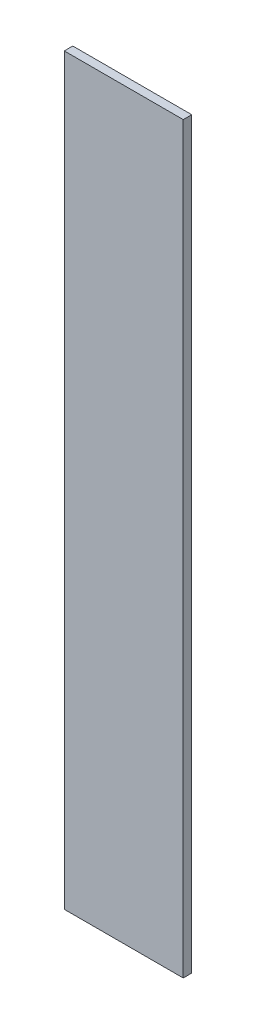
ISO-10303-21;
HEADER;
FILE_DESCRIPTION(('STEP AP214'),'2;1');
FILE_NAME('part.step','',(''),(''),'','','');
FILE_SCHEMA(('AUTOMOTIVE_DESIGN { 1 0 10303 214 1 1 1 1 }'));
ENDSEC;
DATA;
#1=APPLICATION_CONTEXT('core data for automotive mechanical design processes');
#2=APPLICATION_PROTOCOL_DEFINITION('international standard','automotive_design',2000,#1);
#3=PRODUCT_CONTEXT('',#1,'mechanical');
#4=PRODUCT('Part','Part','',(#3));
#5=PRODUCT_RELATED_PRODUCT_CATEGORY('part','',(#4));
#6=PRODUCT_DEFINITION_FORMATION('','',#4);
#7=PRODUCT_DEFINITION_CONTEXT('part definition',#1,'design');
#8=PRODUCT_DEFINITION('design','',#6,#7);
#9=PRODUCT_DEFINITION_SHAPE('','',#8);
#10=(LENGTH_UNIT() NAMED_UNIT(*) SI_UNIT(.MILLI.,.METRE.));
#11=(NAMED_UNIT(*) PLANE_ANGLE_UNIT() SI_UNIT($,.RADIAN.));
#12=(NAMED_UNIT(*) SI_UNIT($,.STERADIAN.) SOLID_ANGLE_UNIT());
#13=UNCERTAINTY_MEASURE_WITH_UNIT(LENGTH_MEASURE(1.E-05),#10,'distance_accuracy_value','');
#14=(GEOMETRIC_REPRESENTATION_CONTEXT(3) GLOBAL_UNCERTAINTY_ASSIGNED_CONTEXT((#13)) GLOBAL_UNIT_ASSIGNED_CONTEXT((#10,
#11,#12)) REPRESENTATION_CONTEXT('',''));
#15=CARTESIAN_POINT('',(0.,0.,0.));
#16=DIRECTION('',(0.,0.,1.));
#17=DIRECTION('',(1.,0.,0.));
#18=AXIS2_PLACEMENT_3D('',#15,#16,#17);
#19=CARTESIAN_POINT('',(0.,0.,0.0962));
#20=DIRECTION('',(0.,0.,1.));
#21=DIRECTION('',(1.,0.,0.));
#22=AXIS2_PLACEMENT_3D('',#19,#20,#21);
#23=PLANE('',#22);
#24=DIRECTION('',(0.,1.,0.));
#25=VECTOR('',#24,1.);
#26=CARTESIAN_POINT('',(-15.985,3.325,0.0962));
#27=LINE('',#26,#25);
#28=CARTESIAN_POINT('',(-15.985,5.075,0.0962));
#29=VERTEX_POINT('',#28);
#30=CARTESIAN_POINT('',(-15.985,3.325,0.0962));
#31=VERTEX_POINT('',#30);
#32=EDGE_CURVE('E62',#29,#31,#27,.F.);
#33=ORIENTED_EDGE('',*,*,#32,.F.);
#34=DIRECTION('',(1.,0.,0.));
#35=VECTOR('',#34,1.);
#36=CARTESIAN_POINT('',(0.,5.075,0.0962));
#37=LINE('',#36,#35);
#38=CARTESIAN_POINT('',(-16.265,5.075,0.0962));
#39=VERTEX_POINT('',#38);
#40=EDGE_CURVE('E20',#29,#39,#37,.F.);
#41=ORIENTED_EDGE('',*,*,#40,.T.);
#42=DIRECTION('',(0.,1.,0.));
#43=VECTOR('',#42,1.);
#44=CARTESIAN_POINT('',(-16.265,5.075,0.0962));
#45=LINE('',#44,#43);
#46=CARTESIAN_POINT('',(-16.265,3.325,0.0962));
#47=VERTEX_POINT('',#46);
#48=EDGE_CURVE('E69',#47,#39,#45,.T.);
#49=ORIENTED_EDGE('',*,*,#48,.F.);
#50=DIRECTION('',(1.,0.,0.));
#51=VECTOR('',#50,1.);
#52=CARTESIAN_POINT('',(-16.265,3.325,0.0962));
#53=LINE('',#52,#51);
#54=EDGE_CURVE('E56',#31,#47,#53,.F.);
#55=ORIENTED_EDGE('',*,*,#54,.F.);
#56=EDGE_LOOP('',(#33,#41,#49,#55));
#57=FACE_BOUND('',#56,.T.);
#58=ADVANCED_FACE('F17',(#57),#23,.T.);
#59=CARTESIAN_POINT('',(-15.985,3.325,0.0762));
#60=DIRECTION('',(1.,0.,0.));
#61=DIRECTION('',(0.,0.,-1.));
#62=AXIS2_PLACEMENT_3D('',#59,#60,#61);
#63=PLANE('',#62);
#64=DIRECTION('',(0.,0.,-1.));
#65=VECTOR('',#64,1.);
#66=CARTESIAN_POINT('',(-15.985,3.325,0.0762));
#67=LINE('',#66,#65);
#68=CARTESIAN_POINT('',(-15.985,3.325,0.0762));
#69=VERTEX_POINT('',#68);
#70=EDGE_CURVE('E64',#69,#31,#67,.F.);
#71=ORIENTED_EDGE('',*,*,#70,.F.);
#72=DIRECTION('',(0.,1.,0.));
#73=VECTOR('',#72,1.);
#74=CARTESIAN_POINT('',(-15.985,-4.29,0.0762));
#75=LINE('',#74,#73);
#76=CARTESIAN_POINT('',(-15.985,5.075,0.0762));
#77=VERTEX_POINT('',#76);
#78=EDGE_CURVE('E83',#77,#69,#75,.F.);
#79=ORIENTED_EDGE('',*,*,#78,.F.);
#80=DIRECTION('',(0.,0.,1.));
#81=VECTOR('',#80,1.);
#82=CARTESIAN_POINT('',(-15.985,5.075,0.0762));
#83=LINE('',#82,#81);
#84=EDGE_CURVE('E67',#29,#77,#83,.F.);
#85=ORIENTED_EDGE('',*,*,#84,.F.);
#86=ORIENTED_EDGE('',*,*,#32,.T.);
#87=EDGE_LOOP('',(#71,#79,#85,#86));
#88=FACE_BOUND('',#87,.T.);
#89=ADVANCED_FACE('F63',(#88),#63,.T.);
#90=CARTESIAN_POINT('',(-16.265,3.325,0.0762));
#91=DIRECTION('',(0.,-1.,0.));
#92=DIRECTION('',(0.,0.,-1.));
#93=AXIS2_PLACEMENT_3D('',#90,#91,#92);
#94=PLANE('',#93);
#95=DIRECTION('',(0.,0.,1.));
#96=VECTOR('',#95,1.);
#97=CARTESIAN_POINT('',(-16.265,3.325,0.0762));
#98=LINE('',#97,#96);
#99=CARTESIAN_POINT('',(-16.265,3.325,0.0762));
#100=VERTEX_POINT('',#99);
#101=EDGE_CURVE('E71',#100,#47,#98,.T.);
#102=ORIENTED_EDGE('',*,*,#101,.F.);
#103=DIRECTION('',(-1.,0.,0.));
#104=VECTOR('',#103,1.);
#105=CARTESIAN_POINT('',(-32.815,3.325,0.0762));
#106=LINE('',#105,#104);
#107=EDGE_CURVE('E75',#69,#100,#106,.T.);
#108=ORIENTED_EDGE('',*,*,#107,.F.);
#109=ORIENTED_EDGE('',*,*,#70,.T.);
#110=ORIENTED_EDGE('',*,*,#54,.T.);
#111=EDGE_LOOP('',(#102,#108,#109,#110));
#112=FACE_BOUND('',#111,.T.);
#113=ADVANCED_FACE('F73',(#112),#94,.T.);
#114=CARTESIAN_POINT('',(-16.265,5.075,0.0762));
#115=DIRECTION('',(-1.,0.,0.));
#116=DIRECTION('',(0.,0.,1.));
#117=AXIS2_PLACEMENT_3D('',#114,#115,#116);
#118=PLANE('',#117);
#119=DIRECTION('',(0.,0.,1.));
#120=VECTOR('',#119,1.);
#121=CARTESIAN_POINT('',(-16.265,5.075,0.0762));
#122=LINE('',#121,#120);
#123=CARTESIAN_POINT('',(-16.265,5.075,0.0762));
#124=VERTEX_POINT('',#123);
#125=EDGE_CURVE('E35',#124,#39,#122,.T.);
#126=ORIENTED_EDGE('',*,*,#125,.F.);
#127=DIRECTION('',(0.,1.,0.));
#128=VECTOR('',#127,1.);
#129=CARTESIAN_POINT('',(-16.265,-4.29,0.0762));
#130=LINE('',#129,#128);
#131=EDGE_CURVE('E26',#100,#124,#130,.T.);
#132=ORIENTED_EDGE('',*,*,#131,.F.);
#133=ORIENTED_EDGE('',*,*,#101,.T.);
#134=ORIENTED_EDGE('',*,*,#48,.T.);
#135=EDGE_LOOP('',(#126,#132,#133,#134));
#136=FACE_BOUND('',#135,.T.);
#137=ADVANCED_FACE('F89',(#136),#118,.T.);
#138=CARTESIAN_POINT('',(-15.985,5.075,0.0762));
#139=DIRECTION('',(0.,1.,0.));
#140=DIRECTION('',(0.,0.,1.));
#141=AXIS2_PLACEMENT_3D('',#138,#139,#140);
#142=PLANE('',#141);
#143=ORIENTED_EDGE('',*,*,#84,.T.);
#144=DIRECTION('',(-1.,0.,0.));
#145=VECTOR('',#144,1.);
#146=CARTESIAN_POINT('',(-32.815,5.075,0.0762));
#147=LINE('',#146,#145);
#148=EDGE_CURVE('E11',#124,#77,#147,.F.);
#149=ORIENTED_EDGE('',*,*,#148,.F.);
#150=ORIENTED_EDGE('',*,*,#125,.T.);
#151=ORIENTED_EDGE('',*,*,#40,.F.);
#152=EDGE_LOOP('',(#143,#149,#150,#151));
#153=FACE_BOUND('',#152,.T.);
#154=ADVANCED_FACE('F91',(#153),#142,.T.);
#155=CARTESIAN_POINT('',(-32.815,-4.29,0.0762));
#156=DIRECTION('',(0.,0.,-1.));
#157=DIRECTION('',(-1.,0.,0.));
#158=AXIS2_PLACEMENT_3D('',#155,#156,#157);
#159=PLANE('',#158);
#160=ORIENTED_EDGE('',*,*,#131,.T.);
#161=ORIENTED_EDGE('',*,*,#148,.T.);
#162=ORIENTED_EDGE('',*,*,#78,.T.);
#163=ORIENTED_EDGE('',*,*,#107,.T.);
#164=EDGE_LOOP('',(#160,#161,#162,#163));
#165=FACE_BOUND('',#164,.T.);
#166=ADVANCED_FACE('F88',(#165),#159,.T.);
#167=CLOSED_SHELL('',(#58,#89,#113,#137,#154,#166));
#168=MANIFOLD_SOLID_BREP('B1',#167);
#169=ADVANCED_BREP_SHAPE_REPRESENTATION('',(#18,#168),#14);
#170=SHAPE_DEFINITION_REPRESENTATION(#9,#169);
ENDSEC;
END-ISO-10303-21;
